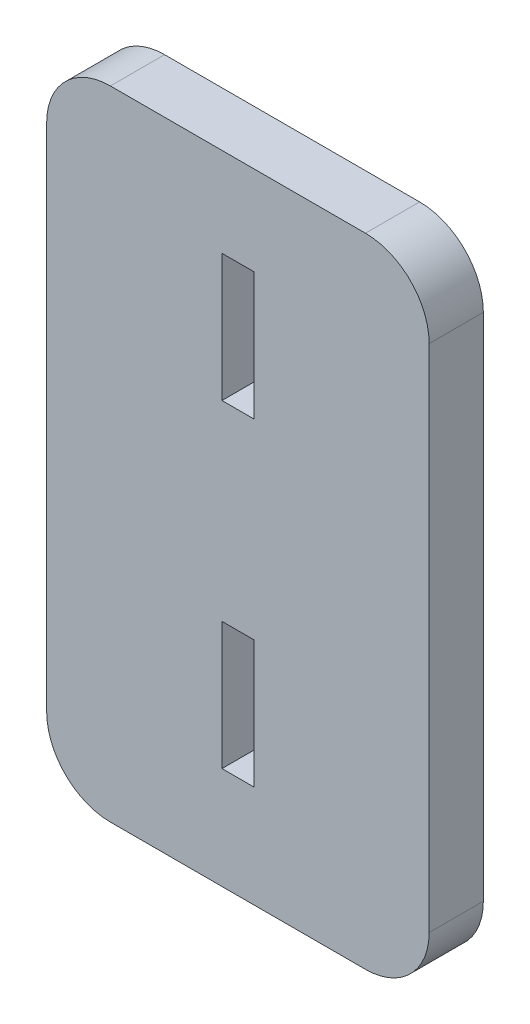
ISO-10303-21;
HEADER;
FILE_DESCRIPTION(('STEP AP214'),'2;1');
FILE_NAME('part.step','',(''),(''),'','','');
FILE_SCHEMA(('AUTOMOTIVE_DESIGN { 1 0 10303 214 1 1 1 1 }'));
ENDSEC;
DATA;
#1=APPLICATION_CONTEXT('core data for automotive mechanical design processes');
#2=APPLICATION_PROTOCOL_DEFINITION('international standard','automotive_design',2000,#1);
#3=PRODUCT_CONTEXT('',#1,'mechanical');
#4=PRODUCT('Part','Part','',(#3));
#5=PRODUCT_RELATED_PRODUCT_CATEGORY('part','',(#4));
#6=PRODUCT_DEFINITION_FORMATION('','',#4);
#7=PRODUCT_DEFINITION_CONTEXT('part definition',#1,'design');
#8=PRODUCT_DEFINITION('design','',#6,#7);
#9=PRODUCT_DEFINITION_SHAPE('','',#8);
#10=(LENGTH_UNIT() NAMED_UNIT(*) SI_UNIT(.MILLI.,.METRE.));
#11=(NAMED_UNIT(*) PLANE_ANGLE_UNIT() SI_UNIT($,.RADIAN.));
#12=(NAMED_UNIT(*) SI_UNIT($,.STERADIAN.) SOLID_ANGLE_UNIT());
#13=UNCERTAINTY_MEASURE_WITH_UNIT(LENGTH_MEASURE(1.E-05),#10,'distance_accuracy_value','');
#14=(GEOMETRIC_REPRESENTATION_CONTEXT(3) GLOBAL_UNCERTAINTY_ASSIGNED_CONTEXT((#13)) GLOBAL_UNIT_ASSIGNED_CONTEXT((#10,
#11,#12)) REPRESENTATION_CONTEXT('',''));
#15=CARTESIAN_POINT('',(0.,0.,0.));
#16=DIRECTION('',(0.,0.,1.));
#17=DIRECTION('',(1.,0.,0.));
#18=AXIS2_PLACEMENT_3D('',#15,#16,#17);
#19=CARTESIAN_POINT('',(30.,50.,8.5));
#20=DIRECTION('',(-1.,0.,0.));
#21=DIRECTION('',(0.,-1.,0.));
#22=AXIS2_PLACEMENT_3D('',#19,#20,#21);
#23=PLANE('',#22);
#24=DIRECTION('',(0.,1.,0.));
#25=VECTOR('',#24,1.);
#26=CARTESIAN_POINT('',(30.,50.,8.5));
#27=LINE('',#26,#25);
#28=CARTESIAN_POINT('',(30.,-40.,8.5));
#29=VERTEX_POINT('',#28);
#30=CARTESIAN_POINT('',(30.,40.,8.5));
#31=VERTEX_POINT('',#30);
#32=EDGE_CURVE('E260',#29,#31,#27,.T.);
#33=ORIENTED_EDGE('',*,*,#32,.F.);
#34=DIRECTION('',(0.,0.,-1.));
#35=VECTOR('',#34,1.);
#36=CARTESIAN_POINT('',(30.,-40.,8.5));
#37=LINE('',#36,#35);
#38=CARTESIAN_POINT('',(30.,-40.,0.));
#39=VERTEX_POINT('',#38);
#40=EDGE_CURVE('E304',#29,#39,#37,.T.);
#41=ORIENTED_EDGE('',*,*,#40,.T.);
#42=DIRECTION('',(0.,1.,0.));
#43=VECTOR('',#42,1.);
#44=CARTESIAN_POINT('',(30.,50.,0.));
#45=LINE('',#44,#43);
#46=CARTESIAN_POINT('',(30.,40.,0.));
#47=VERTEX_POINT('',#46);
#48=EDGE_CURVE('E211',#39,#47,#45,.T.);
#49=ORIENTED_EDGE('',*,*,#48,.T.);
#50=DIRECTION('',(0.,0.,-1.));
#51=VECTOR('',#50,1.);
#52=CARTESIAN_POINT('',(30.,40.,8.5));
#53=LINE('',#52,#51);
#54=EDGE_CURVE('E301',#47,#31,#53,.F.);
#55=ORIENTED_EDGE('',*,*,#54,.T.);
#56=EDGE_LOOP('',(#33,#41,#49,#55));
#57=FACE_BOUND('',#56,.T.);
#58=ADVANCED_FACE('F45',(#57),#23,.F.);
#59=CARTESIAN_POINT('',(-30.,50.,8.5));
#60=DIRECTION('',(0.,-1.,0.));
#61=DIRECTION('',(0.,0.,-1.));
#62=AXIS2_PLACEMENT_3D('',#59,#60,#61);
#63=PLANE('',#62);
#64=DIRECTION('',(-1.,0.,0.));
#65=VECTOR('',#64,1.);
#66=CARTESIAN_POINT('',(-30.,50.,8.5));
#67=LINE('',#66,#65);
#68=CARTESIAN_POINT('',(20.,50.,8.5));
#69=VERTEX_POINT('',#68);
#70=CARTESIAN_POINT('',(-20.,50.,8.5));
#71=VERTEX_POINT('',#70);
#72=EDGE_CURVE('E263',#69,#71,#67,.T.);
#73=ORIENTED_EDGE('',*,*,#72,.F.);
#74=DIRECTION('',(0.,0.,-1.));
#75=VECTOR('',#74,1.);
#76=CARTESIAN_POINT('',(20.,50.,8.5));
#77=LINE('',#76,#75);
#78=CARTESIAN_POINT('',(20.,50.,0.));
#79=VERTEX_POINT('',#78);
#80=EDGE_CURVE('E11',#69,#79,#77,.T.);
#81=ORIENTED_EDGE('',*,*,#80,.T.);
#82=DIRECTION('',(-1.,0.,0.));
#83=VECTOR('',#82,1.);
#84=CARTESIAN_POINT('',(-30.,50.,0.));
#85=LINE('',#84,#83);
#86=CARTESIAN_POINT('',(-20.,50.,0.));
#87=VERTEX_POINT('',#86);
#88=EDGE_CURVE('E278',#79,#87,#85,.T.);
#89=ORIENTED_EDGE('',*,*,#88,.T.);
#90=DIRECTION('',(0.,0.,-1.));
#91=VECTOR('',#90,1.);
#92=CARTESIAN_POINT('',(-20.,50.,8.5));
#93=LINE('',#92,#91);
#94=EDGE_CURVE('E294',#87,#71,#93,.F.);
#95=ORIENTED_EDGE('',*,*,#94,.T.);
#96=EDGE_LOOP('',(#73,#81,#89,#95));
#97=FACE_BOUND('',#96,.T.);
#98=ADVANCED_FACE('F361',(#97),#63,.F.);
#99=CARTESIAN_POINT('',(-30.,50.,8.5));
#100=DIRECTION('',(1.,0.,0.));
#101=DIRECTION('',(0.,0.,-1.));
#102=AXIS2_PLACEMENT_3D('',#99,#100,#101);
#103=PLANE('',#102);
#104=DIRECTION('',(0.,-1.,0.));
#105=VECTOR('',#104,1.);
#106=CARTESIAN_POINT('',(-30.,50.,0.));
#107=LINE('',#106,#105);
#108=CARTESIAN_POINT('',(-30.,40.,0.));
#109=VERTEX_POINT('',#108);
#110=CARTESIAN_POINT('',(-30.,-40.,0.));
#111=VERTEX_POINT('',#110);
#112=EDGE_CURVE('E281',#109,#111,#107,.T.);
#113=ORIENTED_EDGE('',*,*,#112,.T.);
#114=DIRECTION('',(0.,0.,-1.));
#115=VECTOR('',#114,1.);
#116=CARTESIAN_POINT('',(-30.,-40.,8.5));
#117=LINE('',#116,#115);
#118=CARTESIAN_POINT('',(-30.,-40.,8.5));
#119=VERTEX_POINT('',#118);
#120=EDGE_CURVE('E54',#111,#119,#117,.F.);
#121=ORIENTED_EDGE('',*,*,#120,.T.);
#122=DIRECTION('',(0.,-1.,0.));
#123=VECTOR('',#122,1.);
#124=CARTESIAN_POINT('',(-30.,50.,8.5));
#125=LINE('',#124,#123);
#126=CARTESIAN_POINT('',(-30.,40.,8.5));
#127=VERTEX_POINT('',#126);
#128=EDGE_CURVE('E267',#127,#119,#125,.T.);
#129=ORIENTED_EDGE('',*,*,#128,.F.);
#130=DIRECTION('',(0.,0.,-1.));
#131=VECTOR('',#130,1.);
#132=CARTESIAN_POINT('',(-30.,40.,8.5));
#133=LINE('',#132,#131);
#134=EDGE_CURVE('E274',#127,#109,#133,.T.);
#135=ORIENTED_EDGE('',*,*,#134,.T.);
#136=EDGE_LOOP('',(#113,#121,#129,#135));
#137=FACE_BOUND('',#136,.T.);
#138=ADVANCED_FACE('F353',(#137),#103,.F.);
#139=CARTESIAN_POINT('',(-30.,-50.,8.5));
#140=DIRECTION('',(0.,1.,0.));
#141=DIRECTION('',(-1.,0.,0.));
#142=AXIS2_PLACEMENT_3D('',#139,#140,#141);
#143=PLANE('',#142);
#144=DIRECTION('',(1.,0.,0.));
#145=VECTOR('',#144,1.);
#146=CARTESIAN_POINT('',(-30.,-50.,0.));
#147=LINE('',#146,#145);
#148=CARTESIAN_POINT('',(-20.,-50.,0.));
#149=VERTEX_POINT('',#148);
#150=CARTESIAN_POINT('',(20.,-50.,0.));
#151=VERTEX_POINT('',#150);
#152=EDGE_CURVE('E264',#149,#151,#147,.T.);
#153=ORIENTED_EDGE('',*,*,#152,.T.);
#154=DIRECTION('',(0.,0.,-1.));
#155=VECTOR('',#154,1.);
#156=CARTESIAN_POINT('',(20.,-50.,8.5));
#157=LINE('',#156,#155);
#158=CARTESIAN_POINT('',(20.,-50.,8.5));
#159=VERTEX_POINT('',#158);
#160=EDGE_CURVE('E321',#151,#159,#157,.F.);
#161=ORIENTED_EDGE('',*,*,#160,.T.);
#162=DIRECTION('',(1.,0.,0.));
#163=VECTOR('',#162,1.);
#164=CARTESIAN_POINT('',(-30.,-50.,8.5));
#165=LINE('',#164,#163);
#166=CARTESIAN_POINT('',(-20.,-50.,8.5));
#167=VERTEX_POINT('',#166);
#168=EDGE_CURVE('E270',#167,#159,#165,.T.);
#169=ORIENTED_EDGE('',*,*,#168,.F.);
#170=DIRECTION('',(0.,0.,-1.));
#171=VECTOR('',#170,1.);
#172=CARTESIAN_POINT('',(-20.,-50.,8.5));
#173=LINE('',#172,#171);
#174=EDGE_CURVE('E317',#167,#149,#173,.T.);
#175=ORIENTED_EDGE('',*,*,#174,.T.);
#176=EDGE_LOOP('',(#153,#161,#169,#175));
#177=FACE_BOUND('',#176,.T.);
#178=ADVANCED_FACE('F347',(#177),#143,.F.);
#179=CARTESIAN_POINT('',(0.,0.,8.5));
#180=DIRECTION('',(0.,0.,1.));
#181=DIRECTION('',(1.,0.,0.));
#182=AXIS2_PLACEMENT_3D('',#179,#180,#181);
#183=PLANE('',#182);
#184=DIRECTION('',(0.,1.,0.));
#185=VECTOR('',#184,1.);
#186=CARTESIAN_POINT('',(2.5,36.02,8.5));
#187=LINE('',#186,#185);
#188=CARTESIAN_POINT('',(2.5,16.02,8.5));
#189=VERTEX_POINT('',#188);
#190=CARTESIAN_POINT('',(2.5,36.02,8.5));
#191=VERTEX_POINT('',#190);
#192=EDGE_CURVE('E168',#189,#191,#187,.T.);
#193=ORIENTED_EDGE('',*,*,#192,.F.);
#194=DIRECTION('',(1.,0.,0.));
#195=VECTOR('',#194,1.);
#196=CARTESIAN_POINT('',(-2.5,16.02,8.5));
#197=LINE('',#196,#195);
#198=CARTESIAN_POINT('',(-2.5,16.02,8.5));
#199=VERTEX_POINT('',#198);
#200=EDGE_CURVE('E188',#199,#189,#197,.T.);
#201=ORIENTED_EDGE('',*,*,#200,.F.);
#202=DIRECTION('',(0.,-1.,0.));
#203=VECTOR('',#202,1.);
#204=CARTESIAN_POINT('',(-2.5,36.02,8.5));
#205=LINE('',#204,#203);
#206=CARTESIAN_POINT('',(-2.5,36.02,8.5));
#207=VERTEX_POINT('',#206);
#208=EDGE_CURVE('E192',#207,#199,#205,.T.);
#209=ORIENTED_EDGE('',*,*,#208,.F.);
#210=DIRECTION('',(-1.,0.,0.));
#211=VECTOR('',#210,1.);
#212=CARTESIAN_POINT('',(-2.5,36.02,8.5));
#213=LINE('',#212,#211);
#214=EDGE_CURVE('E201',#191,#207,#213,.T.);
#215=ORIENTED_EDGE('',*,*,#214,.F.);
#216=EDGE_LOOP('',(#193,#201,#209,#215));
#217=FACE_BOUND('',#216,.T.);
#218=DIRECTION('',(0.,1.,0.));
#219=VECTOR('',#218,1.);
#220=CARTESIAN_POINT('',(2.5,-13.9800000000001,8.5));
#221=LINE('',#220,#219);
#222=CARTESIAN_POINT('',(2.5,-33.9800000000001,8.5));
#223=VERTEX_POINT('',#222);
#224=CARTESIAN_POINT('',(2.5,-13.9800000000001,8.5));
#225=VERTEX_POINT('',#224);
#226=EDGE_CURVE('E202',#223,#225,#221,.T.);
#227=ORIENTED_EDGE('',*,*,#226,.F.);
#228=DIRECTION('',(1.,0.,0.));
#229=VECTOR('',#228,1.);
#230=CARTESIAN_POINT('',(-2.5,-33.9800000000001,8.5));
#231=LINE('',#230,#229);
#232=CARTESIAN_POINT('',(-2.5,-33.9800000000001,8.5));
#233=VERTEX_POINT('',#232);
#234=EDGE_CURVE('E231',#233,#223,#231,.T.);
#235=ORIENTED_EDGE('',*,*,#234,.F.);
#236=DIRECTION('',(0.,-1.,0.));
#237=VECTOR('',#236,1.);
#238=CARTESIAN_POINT('',(-2.5,-13.9800000000001,8.5));
#239=LINE('',#238,#237);
#240=CARTESIAN_POINT('',(-2.5,-13.9800000000001,8.5));
#241=VERTEX_POINT('',#240);
#242=EDGE_CURVE('E235',#241,#233,#239,.T.);
#243=ORIENTED_EDGE('',*,*,#242,.F.);
#244=DIRECTION('',(-1.,0.,0.));
#245=VECTOR('',#244,1.);
#246=CARTESIAN_POINT('',(-2.5,-13.9800000000001,8.5));
#247=LINE('',#246,#245);
#248=EDGE_CURVE('E240',#225,#241,#247,.T.);
#249=ORIENTED_EDGE('',*,*,#248,.F.);
#250=EDGE_LOOP('',(#227,#235,#243,#249));
#251=FACE_BOUND('',#250,.T.);
#252=ORIENTED_EDGE('',*,*,#168,.T.);
#253=CARTESIAN_POINT('',(20.,-40.,8.5));
#254=DIRECTION('',(0.,0.,1.));
#255=DIRECTION('',(1.,0.,0.));
#256=AXIS2_PLACEMENT_3D('',#253,#254,#255);
#257=CIRCLE('',#256,10.);
#258=EDGE_CURVE('E329',#159,#29,#257,.T.);
#259=ORIENTED_EDGE('',*,*,#258,.T.);
#260=ORIENTED_EDGE('',*,*,#32,.T.);
#261=CARTESIAN_POINT('',(20.,40.,8.5));
#262=DIRECTION('',(0.,0.,1.));
#263=DIRECTION('',(1.,0.,0.));
#264=AXIS2_PLACEMENT_3D('',#261,#262,#263);
#265=CIRCLE('',#264,10.);
#266=EDGE_CURVE('E68',#31,#69,#265,.T.);
#267=ORIENTED_EDGE('',*,*,#266,.T.);
#268=ORIENTED_EDGE('',*,*,#72,.T.);
#269=CARTESIAN_POINT('',(-20.,40.,8.5));
#270=DIRECTION('',(0.,0.,1.));
#271=DIRECTION('',(1.,0.,0.));
#272=AXIS2_PLACEMENT_3D('',#269,#270,#271);
#273=CIRCLE('',#272,10.);
#274=EDGE_CURVE('E298',#71,#127,#273,.T.);
#275=ORIENTED_EDGE('',*,*,#274,.T.);
#276=ORIENTED_EDGE('',*,*,#128,.T.);
#277=CARTESIAN_POINT('',(-20.,-40.,8.5));
#278=DIRECTION('',(0.,0.,1.));
#279=DIRECTION('',(1.,0.,0.));
#280=AXIS2_PLACEMENT_3D('',#277,#278,#279);
#281=CIRCLE('',#280,10.);
#282=EDGE_CURVE('E326',#119,#167,#281,.T.);
#283=ORIENTED_EDGE('',*,*,#282,.T.);
#284=EDGE_LOOP('',(#252,#259,#260,#267,#268,#275,#276,#283));
#285=FACE_BOUND('',#284,.T.);
#286=ADVANCED_FACE('F334',(#217,#251,#285),#183,.T.);
#287=CARTESIAN_POINT('',(0.,0.,0.));
#288=DIRECTION('',(0.,0.,1.));
#289=DIRECTION('',(1.,0.,0.));
#290=AXIS2_PLACEMENT_3D('',#287,#288,#289);
#291=PLANE('',#290);
#292=ORIENTED_EDGE('',*,*,#48,.F.);
#293=CARTESIAN_POINT('',(20.,-40.,0.));
#294=DIRECTION('',(0.,0.,1.));
#295=DIRECTION('',(1.,0.,0.));
#296=AXIS2_PLACEMENT_3D('',#293,#294,#295);
#297=CIRCLE('',#296,10.);
#298=EDGE_CURVE('E314',#39,#151,#297,.F.);
#299=ORIENTED_EDGE('',*,*,#298,.T.);
#300=ORIENTED_EDGE('',*,*,#152,.F.);
#301=CARTESIAN_POINT('',(-20.,-40.,0.));
#302=DIRECTION('',(0.,0.,1.));
#303=DIRECTION('',(1.,0.,0.));
#304=AXIS2_PLACEMENT_3D('',#301,#302,#303);
#305=CIRCLE('',#304,10.);
#306=EDGE_CURVE('E311',#149,#111,#305,.F.);
#307=ORIENTED_EDGE('',*,*,#306,.T.);
#308=ORIENTED_EDGE('',*,*,#112,.F.);
#309=CARTESIAN_POINT('',(-20.,40.,0.));
#310=DIRECTION('',(0.,0.,1.));
#311=DIRECTION('',(1.,0.,0.));
#312=AXIS2_PLACEMENT_3D('',#309,#310,#311);
#313=CIRCLE('',#312,10.);
#314=EDGE_CURVE('E290',#109,#87,#313,.F.);
#315=ORIENTED_EDGE('',*,*,#314,.T.);
#316=ORIENTED_EDGE('',*,*,#88,.F.);
#317=CARTESIAN_POINT('',(20.,40.,0.));
#318=DIRECTION('',(0.,0.,1.));
#319=DIRECTION('',(1.,0.,0.));
#320=AXIS2_PLACEMENT_3D('',#317,#318,#319);
#321=CIRCLE('',#320,10.);
#322=EDGE_CURVE('E308',#79,#47,#321,.F.);
#323=ORIENTED_EDGE('',*,*,#322,.T.);
#324=EDGE_LOOP('',(#292,#299,#300,#307,#308,#315,#316,#323));
#325=FACE_BOUND('',#324,.T.);
#326=ADVANCED_FACE('F345',(#325),#291,.F.);
#327=CARTESIAN_POINT('',(2.5,-13.9800000000001,1.02));
#328=DIRECTION('',(1.,0.,0.));
#329=DIRECTION('',(0.,1.,0.));
#330=AXIS2_PLACEMENT_3D('',#327,#328,#329);
#331=PLANE('',#330);
#332=ORIENTED_EDGE('',*,*,#226,.T.);
#333=DIRECTION('',(0.,0.,1.));
#334=VECTOR('',#333,1.);
#335=CARTESIAN_POINT('',(2.5,-13.9800000000001,1.02));
#336=LINE('',#335,#334);
#337=CARTESIAN_POINT('',(2.5,-13.9800000000001,1.02));
#338=VERTEX_POINT('',#337);
#339=EDGE_CURVE('E217',#338,#225,#336,.T.);
#340=ORIENTED_EDGE('',*,*,#339,.F.);
#341=DIRECTION('',(0.,1.,0.));
#342=VECTOR('',#341,1.);
#343=CARTESIAN_POINT('',(2.5,-13.9800000000001,1.02));
#344=LINE('',#343,#342);
#345=CARTESIAN_POINT('',(2.5,-33.9800000000001,1.02));
#346=VERTEX_POINT('',#345);
#347=EDGE_CURVE('E236',#346,#338,#344,.T.);
#348=ORIENTED_EDGE('',*,*,#347,.F.);
#349=DIRECTION('',(0.,0.,1.));
#350=VECTOR('',#349,1.);
#351=CARTESIAN_POINT('',(2.5,-33.9800000000001,1.02));
#352=LINE('',#351,#350);
#353=EDGE_CURVE('E228',#346,#223,#352,.T.);
#354=ORIENTED_EDGE('',*,*,#353,.T.);
#355=EDGE_LOOP('',(#332,#340,#348,#354));
#356=FACE_BOUND('',#355,.T.);
#357=ADVANCED_FACE('F489',(#356),#331,.F.);
#358=CARTESIAN_POINT('',(-2.5,-33.9800000000001,1.02));
#359=DIRECTION('',(0.,-1.,0.));
#360=DIRECTION('',(0.,0.,-1.));
#361=AXIS2_PLACEMENT_3D('',#358,#359,#360);
#362=PLANE('',#361);
#363=ORIENTED_EDGE('',*,*,#234,.T.);
#364=ORIENTED_EDGE('',*,*,#353,.F.);
#365=DIRECTION('',(1.,0.,0.));
#366=VECTOR('',#365,1.);
#367=CARTESIAN_POINT('',(-2.5,-33.9800000000001,1.02));
#368=LINE('',#367,#366);
#369=CARTESIAN_POINT('',(-2.5,-33.9800000000001,1.02));
#370=VERTEX_POINT('',#369);
#371=EDGE_CURVE('E221',#370,#346,#368,.T.);
#372=ORIENTED_EDGE('',*,*,#371,.F.);
#373=DIRECTION('',(0.,0.,1.));
#374=VECTOR('',#373,1.);
#375=CARTESIAN_POINT('',(-2.5,-33.9800000000001,1.02));
#376=LINE('',#375,#374);
#377=EDGE_CURVE('E225',#370,#233,#376,.T.);
#378=ORIENTED_EDGE('',*,*,#377,.T.);
#379=EDGE_LOOP('',(#363,#364,#372,#378));
#380=FACE_BOUND('',#379,.T.);
#381=ADVANCED_FACE('F479',(#380),#362,.F.);
#382=CARTESIAN_POINT('',(-2.5,-13.9800000000001,1.02));
#383=DIRECTION('',(-1.,0.,0.));
#384=DIRECTION('',(0.,-1.,0.));
#385=AXIS2_PLACEMENT_3D('',#382,#383,#384);
#386=PLANE('',#385);
#387=ORIENTED_EDGE('',*,*,#242,.T.);
#388=ORIENTED_EDGE('',*,*,#377,.F.);
#389=DIRECTION('',(0.,-1.,0.));
#390=VECTOR('',#389,1.);
#391=CARTESIAN_POINT('',(-2.5,-13.9800000000001,1.02));
#392=LINE('',#391,#390);
#393=CARTESIAN_POINT('',(-2.5,-13.9800000000001,1.02));
#394=VERTEX_POINT('',#393);
#395=EDGE_CURVE('E249',#394,#370,#392,.T.);
#396=ORIENTED_EDGE('',*,*,#395,.F.);
#397=DIRECTION('',(0.,0.,1.));
#398=VECTOR('',#397,1.);
#399=CARTESIAN_POINT('',(-2.5,-13.9800000000001,1.02));
#400=LINE('',#399,#398);
#401=EDGE_CURVE('E222',#394,#241,#400,.T.);
#402=ORIENTED_EDGE('',*,*,#401,.T.);
#403=EDGE_LOOP('',(#387,#388,#396,#402));
#404=FACE_BOUND('',#403,.T.);
#405=ADVANCED_FACE('F469',(#404),#386,.F.);
#406=CARTESIAN_POINT('',(-2.5,-13.9800000000001,1.02));
#407=DIRECTION('',(0.,1.,0.));
#408=DIRECTION('',(0.,0.,1.));
#409=AXIS2_PLACEMENT_3D('',#406,#407,#408);
#410=PLANE('',#409);
#411=ORIENTED_EDGE('',*,*,#248,.T.);
#412=ORIENTED_EDGE('',*,*,#401,.F.);
#413=DIRECTION('',(-1.,0.,0.));
#414=VECTOR('',#413,1.);
#415=CARTESIAN_POINT('',(-2.5,-13.9800000000001,1.02));
#416=LINE('',#415,#414);
#417=EDGE_CURVE('E253',#338,#394,#416,.T.);
#418=ORIENTED_EDGE('',*,*,#417,.F.);
#419=ORIENTED_EDGE('',*,*,#339,.T.);
#420=EDGE_LOOP('',(#411,#412,#418,#419));
#421=FACE_BOUND('',#420,.T.);
#422=ADVANCED_FACE('F459',(#421),#410,.F.);
#423=CARTESIAN_POINT('',(0.,0.,1.02));
#424=DIRECTION('',(0.,0.,1.));
#425=DIRECTION('',(1.,0.,0.));
#426=AXIS2_PLACEMENT_3D('',#423,#424,#425);
#427=PLANE('',#426);
#428=ORIENTED_EDGE('',*,*,#347,.T.);
#429=ORIENTED_EDGE('',*,*,#417,.T.);
#430=ORIENTED_EDGE('',*,*,#395,.T.);
#431=ORIENTED_EDGE('',*,*,#371,.T.);
#432=EDGE_LOOP('',(#428,#429,#430,#431));
#433=FACE_BOUND('',#432,.T.);
#434=ADVANCED_FACE('F450',(#433),#427,.T.);
#435=CARTESIAN_POINT('',(2.5,36.02,1.02));
#436=DIRECTION('',(1.,0.,0.));
#437=DIRECTION('',(0.,1.,0.));
#438=AXIS2_PLACEMENT_3D('',#435,#436,#437);
#439=PLANE('',#438);
#440=ORIENTED_EDGE('',*,*,#192,.T.);
#441=DIRECTION('',(0.,0.,1.));
#442=VECTOR('',#441,1.);
#443=CARTESIAN_POINT('',(2.5,36.02,1.02));
#444=LINE('',#443,#442);
#445=CARTESIAN_POINT('',(2.5,36.02,1.02));
#446=VERTEX_POINT('',#445);
#447=EDGE_CURVE('E161',#446,#191,#444,.T.);
#448=ORIENTED_EDGE('',*,*,#447,.F.);
#449=DIRECTION('',(0.,1.,0.));
#450=VECTOR('',#449,1.);
#451=CARTESIAN_POINT('',(2.5,36.02,1.02));
#452=LINE('',#451,#450);
#453=CARTESIAN_POINT('',(2.5,16.02,1.02));
#454=VERTEX_POINT('',#453);
#455=EDGE_CURVE('E165',#454,#446,#452,.T.);
#456=ORIENTED_EDGE('',*,*,#455,.F.);
#457=DIRECTION('',(0.,0.,1.));
#458=VECTOR('',#457,1.);
#459=CARTESIAN_POINT('',(2.5,16.02,1.02));
#460=LINE('',#459,#458);
#461=EDGE_CURVE('E208',#454,#189,#460,.T.);
#462=ORIENTED_EDGE('',*,*,#461,.T.);
#463=EDGE_LOOP('',(#440,#448,#456,#462));
#464=FACE_BOUND('',#463,.T.);
#465=ADVANCED_FACE('F163',(#464),#439,.F.);
#466=CARTESIAN_POINT('',(-2.5,16.02,1.02));
#467=DIRECTION('',(0.,-1.,0.));
#468=DIRECTION('',(0.,0.,-1.));
#469=AXIS2_PLACEMENT_3D('',#466,#467,#468);
#470=PLANE('',#469);
#471=ORIENTED_EDGE('',*,*,#200,.T.);
#472=ORIENTED_EDGE('',*,*,#461,.F.);
#473=DIRECTION('',(1.,0.,0.));
#474=VECTOR('',#473,1.);
#475=CARTESIAN_POINT('',(-2.5,16.02,1.02));
#476=LINE('',#475,#474);
#477=CARTESIAN_POINT('',(-2.5,16.02,1.02));
#478=VERTEX_POINT('',#477);
#479=EDGE_CURVE('E174',#478,#454,#476,.T.);
#480=ORIENTED_EDGE('',*,*,#479,.F.);
#481=DIRECTION('',(0.,0.,1.));
#482=VECTOR('',#481,1.);
#483=CARTESIAN_POINT('',(-2.5,16.02,1.02));
#484=LINE('',#483,#482);
#485=EDGE_CURVE('E212',#478,#199,#484,.T.);
#486=ORIENTED_EDGE('',*,*,#485,.T.);
#487=EDGE_LOOP('',(#471,#472,#480,#486));
#488=FACE_BOUND('',#487,.T.);
#489=ADVANCED_FACE('F431',(#488),#470,.F.);
#490=CARTESIAN_POINT('',(-2.5,36.02,1.02));
#491=DIRECTION('',(-1.,0.,0.));
#492=DIRECTION('',(0.,-1.,0.));
#493=AXIS2_PLACEMENT_3D('',#490,#491,#492);
#494=PLANE('',#493);
#495=ORIENTED_EDGE('',*,*,#208,.T.);
#496=ORIENTED_EDGE('',*,*,#485,.F.);
#497=DIRECTION('',(0.,-1.,0.));
#498=VECTOR('',#497,1.);
#499=CARTESIAN_POINT('',(-2.5,36.02,1.02));
#500=LINE('',#499,#498);
#501=CARTESIAN_POINT('',(-2.5,36.02,1.02));
#502=VERTEX_POINT('',#501);
#503=EDGE_CURVE('E183',#502,#478,#500,.T.);
#504=ORIENTED_EDGE('',*,*,#503,.F.);
#505=DIRECTION('',(0.,0.,1.));
#506=VECTOR('',#505,1.);
#507=CARTESIAN_POINT('',(-2.5,36.02,1.02));
#508=LINE('',#507,#506);
#509=EDGE_CURVE('E173',#502,#207,#508,.T.);
#510=ORIENTED_EDGE('',*,*,#509,.T.);
#511=EDGE_LOOP('',(#495,#496,#504,#510));
#512=FACE_BOUND('',#511,.T.);
#513=ADVANCED_FACE('F422',(#512),#494,.F.);
#514=CARTESIAN_POINT('',(-2.5,36.02,1.02));
#515=DIRECTION('',(0.,1.,0.));
#516=DIRECTION('',(0.,0.,1.));
#517=AXIS2_PLACEMENT_3D('',#514,#515,#516);
#518=PLANE('',#517);
#519=ORIENTED_EDGE('',*,*,#214,.T.);
#520=ORIENTED_EDGE('',*,*,#509,.F.);
#521=DIRECTION('',(-1.,0.,0.));
#522=VECTOR('',#521,1.);
#523=CARTESIAN_POINT('',(-2.5,36.02,1.02));
#524=LINE('',#523,#522);
#525=EDGE_CURVE('E177',#446,#502,#524,.T.);
#526=ORIENTED_EDGE('',*,*,#525,.F.);
#527=ORIENTED_EDGE('',*,*,#447,.T.);
#528=EDGE_LOOP('',(#519,#520,#526,#527));
#529=FACE_BOUND('',#528,.T.);
#530=ADVANCED_FACE('F178',(#529),#518,.F.);
#531=CARTESIAN_POINT('',(0.,0.,1.02));
#532=DIRECTION('',(0.,0.,1.));
#533=DIRECTION('',(1.,0.,0.));
#534=AXIS2_PLACEMENT_3D('',#531,#532,#533);
#535=PLANE('',#534);
#536=ORIENTED_EDGE('',*,*,#455,.T.);
#537=ORIENTED_EDGE('',*,*,#525,.T.);
#538=ORIENTED_EDGE('',*,*,#503,.T.);
#539=ORIENTED_EDGE('',*,*,#479,.T.);
#540=EDGE_LOOP('',(#536,#537,#538,#539));
#541=FACE_BOUND('',#540,.T.);
#542=ADVANCED_FACE('F185',(#541),#535,.T.);
#543=CARTESIAN_POINT('',(-20.,40.,8.5));
#544=DIRECTION('',(0.,0.,-1.));
#545=DIRECTION('',(-1.,0.,0.));
#546=AXIS2_PLACEMENT_3D('',#543,#544,#545);
#547=CYLINDRICAL_SURFACE('',#546,10.);
#548=ORIENTED_EDGE('',*,*,#274,.F.);
#549=ORIENTED_EDGE('',*,*,#94,.F.);
#550=ORIENTED_EDGE('',*,*,#314,.F.);
#551=ORIENTED_EDGE('',*,*,#134,.F.);
#552=EDGE_LOOP('',(#548,#549,#550,#551));
#553=FACE_BOUND('',#552,.T.);
#554=ADVANCED_FACE('F357',(#553),#547,.T.);
#555=CARTESIAN_POINT('',(20.,-40.,8.5));
#556=DIRECTION('',(0.,0.,-1.));
#557=DIRECTION('',(-1.,0.,0.));
#558=AXIS2_PLACEMENT_3D('',#555,#556,#557);
#559=CYLINDRICAL_SURFACE('',#558,10.);
#560=ORIENTED_EDGE('',*,*,#258,.F.);
#561=ORIENTED_EDGE('',*,*,#160,.F.);
#562=ORIENTED_EDGE('',*,*,#298,.F.);
#563=ORIENTED_EDGE('',*,*,#40,.F.);
#564=EDGE_LOOP('',(#560,#561,#562,#563));
#565=FACE_BOUND('',#564,.T.);
#566=ADVANCED_FACE('F342',(#565),#559,.T.);
#567=CARTESIAN_POINT('',(-20.,-40.,8.5));
#568=DIRECTION('',(0.,0.,-1.));
#569=DIRECTION('',(-1.,0.,0.));
#570=AXIS2_PLACEMENT_3D('',#567,#568,#569);
#571=CYLINDRICAL_SURFACE('',#570,10.);
#572=ORIENTED_EDGE('',*,*,#282,.F.);
#573=ORIENTED_EDGE('',*,*,#120,.F.);
#574=ORIENTED_EDGE('',*,*,#306,.F.);
#575=ORIENTED_EDGE('',*,*,#174,.F.);
#576=EDGE_LOOP('',(#572,#573,#574,#575));
#577=FACE_BOUND('',#576,.T.);
#578=ADVANCED_FACE('F351',(#577),#571,.T.);
#579=CARTESIAN_POINT('',(20.,40.,8.5));
#580=DIRECTION('',(0.,0.,-1.));
#581=DIRECTION('',(-1.,0.,0.));
#582=AXIS2_PLACEMENT_3D('',#579,#580,#581);
#583=CYLINDRICAL_SURFACE('',#582,10.);
#584=ORIENTED_EDGE('',*,*,#266,.F.);
#585=ORIENTED_EDGE('',*,*,#54,.F.);
#586=ORIENTED_EDGE('',*,*,#322,.F.);
#587=ORIENTED_EDGE('',*,*,#80,.F.);
#588=EDGE_LOOP('',(#584,#585,#586,#587));
#589=FACE_BOUND('',#588,.T.);
#590=ADVANCED_FACE('F47',(#589),#583,.T.);
#591=CLOSED_SHELL('',(#58,#98,#138,#178,#286,#326,#357,#381,#405,#422,#434,#465,#489,#513,#530,
#542,#554,#566,#578,#590));
#592=MANIFOLD_SOLID_BREP('B2',#591);
#593=ADVANCED_BREP_SHAPE_REPRESENTATION('',(#18,#592),#14);
#594=SHAPE_DEFINITION_REPRESENTATION(#9,#593);
ENDSEC;
END-ISO-10303-21;
